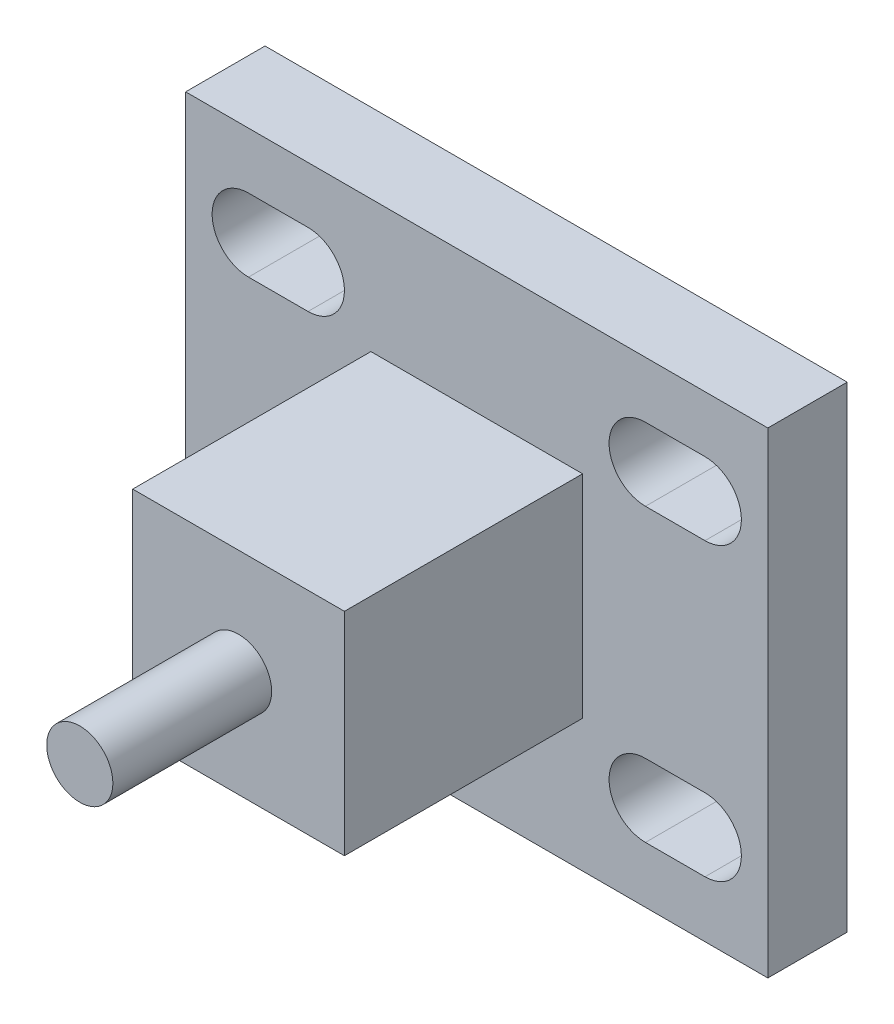
ISO-10303-21;
HEADER;
FILE_DESCRIPTION(('STEP AP214'),'2;1');
FILE_NAME('part.step','',(''),(''),'','','');
FILE_SCHEMA(('AUTOMOTIVE_DESIGN { 1 0 10303 214 1 1 1 1 }'));
ENDSEC;
DATA;
#1=APPLICATION_CONTEXT('core data for automotive mechanical design processes');
#2=APPLICATION_PROTOCOL_DEFINITION('international standard','automotive_design',2000,#1);
#3=PRODUCT_CONTEXT('',#1,'mechanical');
#4=PRODUCT('Part','Part','',(#3));
#5=PRODUCT_RELATED_PRODUCT_CATEGORY('part','',(#4));
#6=PRODUCT_DEFINITION_FORMATION('','',#4);
#7=PRODUCT_DEFINITION_CONTEXT('part definition',#1,'design');
#8=PRODUCT_DEFINITION('design','',#6,#7);
#9=PRODUCT_DEFINITION_SHAPE('','',#8);
#10=(LENGTH_UNIT() NAMED_UNIT(*) SI_UNIT(.MILLI.,.METRE.));
#11=(NAMED_UNIT(*) PLANE_ANGLE_UNIT() SI_UNIT($,.RADIAN.));
#12=(NAMED_UNIT(*) SI_UNIT($,.STERADIAN.) SOLID_ANGLE_UNIT());
#13=UNCERTAINTY_MEASURE_WITH_UNIT(LENGTH_MEASURE(1.E-05),#10,'distance_accuracy_value','');
#14=(GEOMETRIC_REPRESENTATION_CONTEXT(3) GLOBAL_UNCERTAINTY_ASSIGNED_CONTEXT((#13)) GLOBAL_UNIT_ASSIGNED_CONTEXT((#10,
#11,#12)) REPRESENTATION_CONTEXT('',''));
#15=CARTESIAN_POINT('',(0.,0.,0.));
#16=DIRECTION('',(0.,0.,1.));
#17=DIRECTION('',(1.,0.,0.));
#18=AXIS2_PLACEMENT_3D('',#15,#16,#17);
#19=CARTESIAN_POINT('',(0.,0.,36.));
#20=DIRECTION('',(0.,0.,1.));
#21=DIRECTION('',(1.,0.,0.));
#22=AXIS2_PLACEMENT_3D('',#19,#20,#21);
#23=PLANE('',#22);
#24=CARTESIAN_POINT('',(0.,0.,36.));
#25=DIRECTION('',(0.,0.,1.));
#26=DIRECTION('',(1.,0.,0.));
#27=AXIS2_PLACEMENT_3D('',#24,#25,#26);
#28=CIRCLE('',#27,2.5);
#29=CARTESIAN_POINT('',(2.5,0.,36.));
#30=VERTEX_POINT('',#29);
#31=EDGE_CURVE('E10',#30,#30,#28,.T.);
#32=ORIENTED_EDGE('',*,*,#31,.T.);
#33=EDGE_LOOP('',(#32));
#34=FACE_BOUND('',#33,.T.);
#35=ADVANCED_FACE('F16',(#34),#23,.T.);
#36=CARTESIAN_POINT('',(0.,0.,24.));
#37=DIRECTION('',(0.,0.,1.));
#38=DIRECTION('',(1.,0.,0.));
#39=AXIS2_PLACEMENT_3D('',#36,#37,#38);
#40=CYLINDRICAL_SURFACE('',#39,2.5);
#41=ORIENTED_EDGE('',*,*,#31,.F.);
#42=EDGE_LOOP('',(#41));
#43=FACE_BOUND('',#42,.T.);
#44=CARTESIAN_POINT('',(0.,0.,24.));
#45=DIRECTION('',(0.,0.,1.));
#46=DIRECTION('',(1.,0.,0.));
#47=AXIS2_PLACEMENT_3D('',#44,#45,#46);
#48=CIRCLE('',#47,2.5);
#49=CARTESIAN_POINT('',(2.5,0.,24.));
#50=VERTEX_POINT('',#49);
#51=EDGE_CURVE('E26',#50,#50,#48,.T.);
#52=ORIENTED_EDGE('',*,*,#51,.T.);
#53=EDGE_LOOP('',(#52));
#54=FACE_BOUND('',#53,.T.);
#55=ADVANCED_FACE('F559',(#43,#54),#40,.T.);
#56=CARTESIAN_POINT('',(-8.,-8.,24.));
#57=DIRECTION('',(0.,0.,1.));
#58=DIRECTION('',(1.,0.,0.));
#59=AXIS2_PLACEMENT_3D('',#56,#57,#58);
#60=PLANE('',#59);
#61=ORIENTED_EDGE('',*,*,#51,.F.);
#62=EDGE_LOOP('',(#61));
#63=FACE_BOUND('',#62,.T.);
#64=DIRECTION('',(0.,1.,0.));
#65=VECTOR('',#64,1.);
#66=CARTESIAN_POINT('',(-8.,-8.,24.));
#67=LINE('',#66,#65);
#68=CARTESIAN_POINT('',(-8.,-8.,24.));
#69=VERTEX_POINT('',#68);
#70=CARTESIAN_POINT('',(-8.,8.,24.));
#71=VERTEX_POINT('',#70);
#72=EDGE_CURVE('E160',#69,#71,#67,.T.);
#73=ORIENTED_EDGE('',*,*,#72,.F.);
#74=DIRECTION('',(1.,0.,0.));
#75=VECTOR('',#74,1.);
#76=CARTESIAN_POINT('',(-8.,-8.,24.));
#77=LINE('',#76,#75);
#78=CARTESIAN_POINT('',(8.,-8.,24.));
#79=VERTEX_POINT('',#78);
#80=EDGE_CURVE('E192',#69,#79,#77,.T.);
#81=ORIENTED_EDGE('',*,*,#80,.T.);
#82=DIRECTION('',(0.,1.,0.));
#83=VECTOR('',#82,1.);
#84=CARTESIAN_POINT('',(8.,-8.,24.));
#85=LINE('',#84,#83);
#86=CARTESIAN_POINT('',(8.,8.,24.));
#87=VERTEX_POINT('',#86);
#88=EDGE_CURVE('E39',#79,#87,#85,.T.);
#89=ORIENTED_EDGE('',*,*,#88,.T.);
#90=DIRECTION('',(1.,0.,0.));
#91=VECTOR('',#90,1.);
#92=CARTESIAN_POINT('',(-8.,8.,24.));
#93=LINE('',#92,#91);
#94=EDGE_CURVE('E156',#71,#87,#93,.T.);
#95=ORIENTED_EDGE('',*,*,#94,.F.);
#96=EDGE_LOOP('',(#73,#81,#89,#95));
#97=FACE_BOUND('',#96,.T.);
#98=ADVANCED_FACE('F158',(#63,#97),#60,.T.);
#99=CARTESIAN_POINT('',(17.25,8.25,-1.));
#100=DIRECTION('',(0.,1.,0.));
#101=DIRECTION('',(1.,0.,0.));
#102=AXIS2_PLACEMENT_3D('',#99,#100,#101);
#103=PLANE('',#102);
#104=DIRECTION('',(0.,0.,1.));
#105=VECTOR('',#104,1.);
#106=CARTESIAN_POINT('',(17.25,8.25,-1.));
#107=LINE('',#106,#105);
#108=CARTESIAN_POINT('',(17.25,8.25,0.));
#109=VERTEX_POINT('',#108);
#110=CARTESIAN_POINT('',(17.25,8.25,6.));
#111=VERTEX_POINT('',#110);
#112=EDGE_CURVE('E191',#109,#111,#107,.T.);
#113=ORIENTED_EDGE('',*,*,#112,.F.);
#114=DIRECTION('',(-1.,0.,0.));
#115=VECTOR('',#114,1.);
#116=CARTESIAN_POINT('',(-2.375,8.25,0.));
#117=LINE('',#116,#115);
#118=CARTESIAN_POINT('',(12.75,8.25,0.));
#119=VERTEX_POINT('',#118);
#120=EDGE_CURVE('E351',#109,#119,#117,.T.);
#121=ORIENTED_EDGE('',*,*,#120,.T.);
#122=DIRECTION('',(0.,0.,1.));
#123=VECTOR('',#122,1.);
#124=CARTESIAN_POINT('',(12.75,8.25,-1.));
#125=LINE('',#124,#123);
#126=CARTESIAN_POINT('',(12.75,8.25,6.));
#127=VERTEX_POINT('',#126);
#128=EDGE_CURVE('E19',#119,#127,#125,.T.);
#129=ORIENTED_EDGE('',*,*,#128,.T.);
#130=DIRECTION('',(-1.,0.,0.));
#131=VECTOR('',#130,1.);
#132=CARTESIAN_POINT('',(-2.375,8.25,6.));
#133=LINE('',#132,#131);
#134=EDGE_CURVE('E292',#111,#127,#133,.T.);
#135=ORIENTED_EDGE('',*,*,#134,.F.);
#136=EDGE_LOOP('',(#113,#121,#129,#135));
#137=FACE_BOUND('',#136,.T.);
#138=ADVANCED_FACE('F569',(#137),#103,.T.);
#139=CARTESIAN_POINT('',(12.75,11.,-1.));
#140=DIRECTION('',(0.,0.,1.));
#141=DIRECTION('',(0.,1.,0.));
#142=AXIS2_PLACEMENT_3D('',#139,#140,#141);
#143=CYLINDRICAL_SURFACE('',#142,2.75);
#144=ORIENTED_EDGE('',*,*,#128,.F.);
#145=CARTESIAN_POINT('',(12.75,11.,0.));
#146=DIRECTION('',(0.,0.,1.));
#147=DIRECTION('',(0.,1.,0.));
#148=AXIS2_PLACEMENT_3D('',#145,#146,#147);
#149=CIRCLE('',#148,2.75);
#150=CARTESIAN_POINT('',(12.75,13.75,0.));
#151=VERTEX_POINT('',#150);
#152=EDGE_CURVE('E360',#151,#119,#149,.T.);
#153=ORIENTED_EDGE('',*,*,#152,.F.);
#154=DIRECTION('',(0.,0.,1.));
#155=VECTOR('',#154,1.);
#156=CARTESIAN_POINT('',(12.75,13.75,-1.));
#157=LINE('',#156,#155);
#158=CARTESIAN_POINT('',(12.75,13.75,6.));
#159=VERTEX_POINT('',#158);
#160=EDGE_CURVE('E195',#151,#159,#157,.T.);
#161=ORIENTED_EDGE('',*,*,#160,.T.);
#162=CARTESIAN_POINT('',(12.75,11.,6.));
#163=DIRECTION('',(0.,0.,1.));
#164=DIRECTION('',(0.,1.,0.));
#165=AXIS2_PLACEMENT_3D('',#162,#163,#164);
#166=CIRCLE('',#165,2.75);
#167=EDGE_CURVE('E302',#159,#127,#166,.T.);
#168=ORIENTED_EDGE('',*,*,#167,.T.);
#169=EDGE_LOOP('',(#144,#153,#161,#168));
#170=FACE_BOUND('',#169,.T.);
#171=ADVANCED_FACE('F575',(#170),#143,.F.);
#172=CARTESIAN_POINT('',(17.25,13.75,-1.));
#173=DIRECTION('',(0.,1.,0.));
#174=DIRECTION('',(1.,0.,0.));
#175=AXIS2_PLACEMENT_3D('',#172,#173,#174);
#176=PLANE('',#175);
#177=DIRECTION('',(-1.,0.,0.));
#178=VECTOR('',#177,1.);
#179=CARTESIAN_POINT('',(-2.375,13.75,6.));
#180=LINE('',#179,#178);
#181=CARTESIAN_POINT('',(17.25,13.75,6.));
#182=VERTEX_POINT('',#181);
#183=EDGE_CURVE('E305',#182,#159,#180,.T.);
#184=ORIENTED_EDGE('',*,*,#183,.T.);
#185=ORIENTED_EDGE('',*,*,#160,.F.);
#186=DIRECTION('',(-1.,0.,0.));
#187=VECTOR('',#186,1.);
#188=CARTESIAN_POINT('',(-2.375,13.75,0.));
#189=LINE('',#188,#187);
#190=CARTESIAN_POINT('',(17.25,13.75,0.));
#191=VERTEX_POINT('',#190);
#192=EDGE_CURVE('E356',#191,#151,#189,.T.);
#193=ORIENTED_EDGE('',*,*,#192,.F.);
#194=DIRECTION('',(0.,0.,1.));
#195=VECTOR('',#194,1.);
#196=CARTESIAN_POINT('',(17.25,13.75,-1.));
#197=LINE('',#196,#195);
#198=EDGE_CURVE('E193',#191,#182,#197,.T.);
#199=ORIENTED_EDGE('',*,*,#198,.T.);
#200=EDGE_LOOP('',(#184,#185,#193,#199));
#201=FACE_BOUND('',#200,.T.);
#202=ADVANCED_FACE('F578',(#201),#176,.F.);
#203=CARTESIAN_POINT('',(17.25,11.,-1.));
#204=DIRECTION('',(0.,0.,1.));
#205=DIRECTION('',(0.,1.,0.));
#206=AXIS2_PLACEMENT_3D('',#203,#204,#205);
#207=CYLINDRICAL_SURFACE('',#206,2.75);
#208=ORIENTED_EDGE('',*,*,#112,.T.);
#209=CARTESIAN_POINT('',(17.25,11.,6.));
#210=DIRECTION('',(0.,0.,1.));
#211=DIRECTION('',(0.,1.,0.));
#212=AXIS2_PLACEMENT_3D('',#209,#210,#211);
#213=CIRCLE('',#212,2.75);
#214=EDGE_CURVE('E288',#111,#182,#213,.T.);
#215=ORIENTED_EDGE('',*,*,#214,.T.);
#216=ORIENTED_EDGE('',*,*,#198,.F.);
#217=CARTESIAN_POINT('',(17.25,11.,0.));
#218=DIRECTION('',(0.,0.,1.));
#219=DIRECTION('',(0.,1.,0.));
#220=AXIS2_PLACEMENT_3D('',#217,#218,#219);
#221=CIRCLE('',#220,2.75);
#222=EDGE_CURVE('E346',#109,#191,#221,.T.);
#223=ORIENTED_EDGE('',*,*,#222,.F.);
#224=EDGE_LOOP('',(#208,#215,#216,#223));
#225=FACE_BOUND('',#224,.T.);
#226=ADVANCED_FACE('F581',(#225),#207,.F.);
#227=CARTESIAN_POINT('',(8.,-8.,6.));
#228=DIRECTION('',(1.,0.,0.));
#229=DIRECTION('',(0.,1.,0.));
#230=AXIS2_PLACEMENT_3D('',#227,#228,#229);
#231=PLANE('',#230);
#232=DIRECTION('',(0.,0.,1.));
#233=VECTOR('',#232,1.);
#234=CARTESIAN_POINT('',(8.,-8.,6.));
#235=LINE('',#234,#233);
#236=CARTESIAN_POINT('',(8.,-8.,6.));
#237=VERTEX_POINT('',#236);
#238=EDGE_CURVE('E188',#237,#79,#235,.T.);
#239=ORIENTED_EDGE('',*,*,#238,.F.);
#240=DIRECTION('',(0.,1.,0.));
#241=VECTOR('',#240,1.);
#242=CARTESIAN_POINT('',(8.,-8.,6.));
#243=LINE('',#242,#241);
#244=CARTESIAN_POINT('',(8.,8.,6.));
#245=VERTEX_POINT('',#244);
#246=EDGE_CURVE('E272',#237,#245,#243,.T.);
#247=ORIENTED_EDGE('',*,*,#246,.T.);
#248=DIRECTION('',(0.,0.,1.));
#249=VECTOR('',#248,1.);
#250=CARTESIAN_POINT('',(8.,8.,6.));
#251=LINE('',#250,#249);
#252=EDGE_CURVE('E163',#245,#87,#251,.T.);
#253=ORIENTED_EDGE('',*,*,#252,.T.);
#254=ORIENTED_EDGE('',*,*,#88,.F.);
#255=EDGE_LOOP('',(#239,#247,#253,#254));
#256=FACE_BOUND('',#255,.T.);
#257=ADVANCED_FACE('F585',(#256),#231,.T.);
#258=CARTESIAN_POINT('',(-8.,-8.,6.));
#259=DIRECTION('',(0.,1.,0.));
#260=DIRECTION('',(1.,0.,0.));
#261=AXIS2_PLACEMENT_3D('',#258,#259,#260);
#262=PLANE('',#261);
#263=ORIENTED_EDGE('',*,*,#238,.T.);
#264=ORIENTED_EDGE('',*,*,#80,.F.);
#265=DIRECTION('',(0.,0.,1.));
#266=VECTOR('',#265,1.);
#267=CARTESIAN_POINT('',(-8.,-8.,6.));
#268=LINE('',#267,#266);
#269=CARTESIAN_POINT('',(-8.,-8.,6.));
#270=VERTEX_POINT('',#269);
#271=EDGE_CURVE('E164',#270,#69,#268,.T.);
#272=ORIENTED_EDGE('',*,*,#271,.F.);
#273=DIRECTION('',(1.,0.,0.));
#274=VECTOR('',#273,1.);
#275=CARTESIAN_POINT('',(-8.,-8.,6.));
#276=LINE('',#275,#274);
#277=EDGE_CURVE('E276',#270,#237,#276,.T.);
#278=ORIENTED_EDGE('',*,*,#277,.T.);
#279=EDGE_LOOP('',(#263,#264,#272,#278));
#280=FACE_BOUND('',#279,.T.);
#281=ADVANCED_FACE('F587',(#280),#262,.F.);
#282=CARTESIAN_POINT('',(-8.,8.,6.));
#283=DIRECTION('',(0.,1.,0.));
#284=DIRECTION('',(1.,0.,0.));
#285=AXIS2_PLACEMENT_3D('',#282,#283,#284);
#286=PLANE('',#285);
#287=DIRECTION('',(1.,0.,0.));
#288=VECTOR('',#287,1.);
#289=CARTESIAN_POINT('',(-8.,8.,6.));
#290=LINE('',#289,#288);
#291=CARTESIAN_POINT('',(-8.,8.,6.));
#292=VERTEX_POINT('',#291);
#293=EDGE_CURVE('E170',#292,#245,#290,.T.);
#294=ORIENTED_EDGE('',*,*,#293,.F.);
#295=DIRECTION('',(0.,0.,1.));
#296=VECTOR('',#295,1.);
#297=CARTESIAN_POINT('',(-8.,8.,6.));
#298=LINE('',#297,#296);
#299=EDGE_CURVE('E167',#292,#71,#298,.T.);
#300=ORIENTED_EDGE('',*,*,#299,.T.);
#301=ORIENTED_EDGE('',*,*,#94,.T.);
#302=ORIENTED_EDGE('',*,*,#252,.F.);
#303=EDGE_LOOP('',(#294,#300,#301,#302));
#304=FACE_BOUND('',#303,.T.);
#305=ADVANCED_FACE('F168',(#304),#286,.T.);
#306=CARTESIAN_POINT('',(-8.,-8.,6.));
#307=DIRECTION('',(1.,0.,0.));
#308=DIRECTION('',(0.,1.,0.));
#309=AXIS2_PLACEMENT_3D('',#306,#307,#308);
#310=PLANE('',#309);
#311=ORIENTED_EDGE('',*,*,#72,.T.);
#312=ORIENTED_EDGE('',*,*,#299,.F.);
#313=DIRECTION('',(0.,1.,0.));
#314=VECTOR('',#313,1.);
#315=CARTESIAN_POINT('',(-8.,-8.,6.));
#316=LINE('',#315,#314);
#317=EDGE_CURVE('E267',#270,#292,#316,.T.);
#318=ORIENTED_EDGE('',*,*,#317,.F.);
#319=ORIENTED_EDGE('',*,*,#271,.T.);
#320=EDGE_LOOP('',(#311,#312,#318,#319));
#321=FACE_BOUND('',#320,.T.);
#322=ADVANCED_FACE('F177',(#321),#310,.F.);
#323=CARTESIAN_POINT('',(-17.25,11.,-1.));
#324=DIRECTION('',(0.,0.,1.));
#325=DIRECTION('',(0.,1.,0.));
#326=AXIS2_PLACEMENT_3D('',#323,#324,#325);
#327=CYLINDRICAL_SURFACE('',#326,2.75);
#328=DIRECTION('',(0.,0.,1.));
#329=VECTOR('',#328,1.);
#330=CARTESIAN_POINT('',(-17.25,8.25,-1.));
#331=LINE('',#330,#329);
#332=CARTESIAN_POINT('',(-17.25,8.25,0.));
#333=VERTEX_POINT('',#332);
#334=CARTESIAN_POINT('',(-17.25,8.25,6.));
#335=VERTEX_POINT('',#334);
#336=EDGE_CURVE('E184',#333,#335,#331,.T.);
#337=ORIENTED_EDGE('',*,*,#336,.F.);
#338=CARTESIAN_POINT('',(-17.25,11.,0.));
#339=DIRECTION('',(0.,0.,1.));
#340=DIRECTION('',(0.,1.,0.));
#341=AXIS2_PLACEMENT_3D('',#338,#339,#340);
#342=CIRCLE('',#341,2.75);
#343=CARTESIAN_POINT('',(-17.25,13.75,0.));
#344=VERTEX_POINT('',#343);
#345=EDGE_CURVE('E318',#344,#333,#342,.T.);
#346=ORIENTED_EDGE('',*,*,#345,.F.);
#347=DIRECTION('',(0.,0.,1.));
#348=VECTOR('',#347,1.);
#349=CARTESIAN_POINT('',(-17.25,13.75,-1.));
#350=LINE('',#349,#348);
#351=CARTESIAN_POINT('',(-17.25,13.75,6.));
#352=VERTEX_POINT('',#351);
#353=EDGE_CURVE('E179',#344,#352,#350,.T.);
#354=ORIENTED_EDGE('',*,*,#353,.T.);
#355=CARTESIAN_POINT('',(-17.25,11.,6.));
#356=DIRECTION('',(0.,0.,1.));
#357=DIRECTION('',(0.,1.,0.));
#358=AXIS2_PLACEMENT_3D('',#355,#356,#357);
#359=CIRCLE('',#358,2.75);
#360=EDGE_CURVE('E259',#352,#335,#359,.T.);
#361=ORIENTED_EDGE('',*,*,#360,.T.);
#362=EDGE_LOOP('',(#337,#346,#354,#361));
#363=FACE_BOUND('',#362,.T.);
#364=ADVANCED_FACE('F467',(#363),#327,.F.);
#365=CARTESIAN_POINT('',(-12.75,13.75,-1.));
#366=DIRECTION('',(0.,1.,0.));
#367=DIRECTION('',(1.,0.,0.));
#368=AXIS2_PLACEMENT_3D('',#365,#366,#367);
#369=PLANE('',#368);
#370=DIRECTION('',(-1.,0.,0.));
#371=VECTOR('',#370,1.);
#372=CARTESIAN_POINT('',(-17.375,13.75,6.));
#373=LINE('',#372,#371);
#374=CARTESIAN_POINT('',(-12.75,13.75,6.));
#375=VERTEX_POINT('',#374);
#376=EDGE_CURVE('E263',#375,#352,#373,.T.);
#377=ORIENTED_EDGE('',*,*,#376,.T.);
#378=ORIENTED_EDGE('',*,*,#353,.F.);
#379=DIRECTION('',(-1.,0.,0.));
#380=VECTOR('',#379,1.);
#381=CARTESIAN_POINT('',(-17.375,13.75,0.));
#382=LINE('',#381,#380);
#383=CARTESIAN_POINT('',(-12.75,13.75,0.));
#384=VERTEX_POINT('',#383);
#385=EDGE_CURVE('E297',#384,#344,#382,.T.);
#386=ORIENTED_EDGE('',*,*,#385,.F.);
#387=DIRECTION('',(0.,0.,1.));
#388=VECTOR('',#387,1.);
#389=CARTESIAN_POINT('',(-12.75,13.75,-1.));
#390=LINE('',#389,#388);
#391=EDGE_CURVE('E237',#384,#375,#390,.T.);
#392=ORIENTED_EDGE('',*,*,#391,.T.);
#393=EDGE_LOOP('',(#377,#378,#386,#392));
#394=FACE_BOUND('',#393,.T.);
#395=ADVANCED_FACE('F463',(#394),#369,.F.);
#396=CARTESIAN_POINT('',(-12.75,8.25,-1.));
#397=DIRECTION('',(0.,1.,0.));
#398=DIRECTION('',(1.,0.,0.));
#399=AXIS2_PLACEMENT_3D('',#396,#397,#398);
#400=PLANE('',#399);
#401=DIRECTION('',(0.,0.,1.));
#402=VECTOR('',#401,1.);
#403=CARTESIAN_POINT('',(-12.75,8.25,-1.));
#404=LINE('',#403,#402);
#405=CARTESIAN_POINT('',(-12.75,8.25,0.));
#406=VERTEX_POINT('',#405);
#407=CARTESIAN_POINT('',(-12.75,8.25,6.));
#408=VERTEX_POINT('',#407);
#409=EDGE_CURVE('E233',#406,#408,#404,.T.);
#410=ORIENTED_EDGE('',*,*,#409,.F.);
#411=DIRECTION('',(-1.,0.,0.));
#412=VECTOR('',#411,1.);
#413=CARTESIAN_POINT('',(-17.375,8.25,0.));
#414=LINE('',#413,#412);
#415=EDGE_CURVE('E345',#406,#333,#414,.T.);
#416=ORIENTED_EDGE('',*,*,#415,.T.);
#417=ORIENTED_EDGE('',*,*,#336,.T.);
#418=DIRECTION('',(-1.,0.,0.));
#419=VECTOR('',#418,1.);
#420=CARTESIAN_POINT('',(-17.375,8.25,6.));
#421=LINE('',#420,#419);
#422=EDGE_CURVE('E255',#408,#335,#421,.T.);
#423=ORIENTED_EDGE('',*,*,#422,.F.);
#424=EDGE_LOOP('',(#410,#416,#417,#423));
#425=FACE_BOUND('',#424,.T.);
#426=ADVANCED_FACE('F468',(#425),#400,.T.);
#427=CARTESIAN_POINT('',(-12.75,11.,-1.));
#428=DIRECTION('',(0.,0.,1.));
#429=DIRECTION('',(0.,1.,0.));
#430=AXIS2_PLACEMENT_3D('',#427,#428,#429);
#431=CYLINDRICAL_SURFACE('',#430,2.75);
#432=ORIENTED_EDGE('',*,*,#409,.T.);
#433=CARTESIAN_POINT('',(-12.75,11.,6.));
#434=DIRECTION('',(0.,0.,1.));
#435=DIRECTION('',(0.,1.,0.));
#436=AXIS2_PLACEMENT_3D('',#433,#434,#435);
#437=CIRCLE('',#436,2.75);
#438=EDGE_CURVE('E251',#408,#375,#437,.T.);
#439=ORIENTED_EDGE('',*,*,#438,.T.);
#440=ORIENTED_EDGE('',*,*,#391,.F.);
#441=CARTESIAN_POINT('',(-12.75,11.,0.));
#442=DIRECTION('',(0.,0.,1.));
#443=DIRECTION('',(0.,1.,0.));
#444=AXIS2_PLACEMENT_3D('',#441,#442,#443);
#445=CIRCLE('',#444,2.75);
#446=EDGE_CURVE('E355',#406,#384,#445,.T.);
#447=ORIENTED_EDGE('',*,*,#446,.F.);
#448=EDGE_LOOP('',(#432,#439,#440,#447));
#449=FACE_BOUND('',#448,.T.);
#450=ADVANCED_FACE('F471',(#449),#431,.F.);
#451=CARTESIAN_POINT('',(12.75,-11.,-1.));
#452=DIRECTION('',(0.,0.,1.));
#453=DIRECTION('',(0.,1.,0.));
#454=AXIS2_PLACEMENT_3D('',#451,#452,#453);
#455=CYLINDRICAL_SURFACE('',#454,2.75);
#456=DIRECTION('',(0.,0.,1.));
#457=VECTOR('',#456,1.);
#458=CARTESIAN_POINT('',(12.75,-13.75,-1.));
#459=LINE('',#458,#457);
#460=CARTESIAN_POINT('',(12.75,-13.75,0.));
#461=VERTEX_POINT('',#460);
#462=CARTESIAN_POINT('',(12.75,-13.75,6.));
#463=VERTEX_POINT('',#462);
#464=EDGE_CURVE('E388',#461,#463,#459,.T.);
#465=ORIENTED_EDGE('',*,*,#464,.F.);
#466=CARTESIAN_POINT('',(12.75,-11.,0.));
#467=DIRECTION('',(0.,0.,1.));
#468=DIRECTION('',(0.,1.,0.));
#469=AXIS2_PLACEMENT_3D('',#466,#467,#468);
#470=CIRCLE('',#469,2.75);
#471=CARTESIAN_POINT('',(12.75,-8.25,0.));
#472=VERTEX_POINT('',#471);
#473=EDGE_CURVE('E338',#472,#461,#470,.T.);
#474=ORIENTED_EDGE('',*,*,#473,.F.);
#475=DIRECTION('',(0.,0.,1.));
#476=VECTOR('',#475,1.);
#477=CARTESIAN_POINT('',(12.75,-8.25,-1.));
#478=LINE('',#477,#476);
#479=CARTESIAN_POINT('',(12.75,-8.25,6.));
#480=VERTEX_POINT('',#479);
#481=EDGE_CURVE('E238',#472,#480,#478,.T.);
#482=ORIENTED_EDGE('',*,*,#481,.T.);
#483=CARTESIAN_POINT('',(12.75,-11.,6.));
#484=DIRECTION('',(0.,0.,1.));
#485=DIRECTION('',(0.,1.,0.));
#486=AXIS2_PLACEMENT_3D('',#483,#484,#485);
#487=CIRCLE('',#486,2.75);
#488=EDGE_CURVE('E243',#480,#463,#487,.T.);
#489=ORIENTED_EDGE('',*,*,#488,.T.);
#490=EDGE_LOOP('',(#465,#474,#482,#489));
#491=FACE_BOUND('',#490,.T.);
#492=ADVANCED_FACE('F531',(#491),#455,.F.);
#493=CARTESIAN_POINT('',(17.25,-8.25,-1.));
#494=DIRECTION('',(0.,1.,0.));
#495=DIRECTION('',(1.,0.,0.));
#496=AXIS2_PLACEMENT_3D('',#493,#494,#495);
#497=PLANE('',#496);
#498=DIRECTION('',(-1.,0.,0.));
#499=VECTOR('',#498,1.);
#500=CARTESIAN_POINT('',(-2.375,-8.25,6.));
#501=LINE('',#500,#499);
#502=CARTESIAN_POINT('',(17.25,-8.25,6.));
#503=VERTEX_POINT('',#502);
#504=EDGE_CURVE('E247',#503,#480,#501,.T.);
#505=ORIENTED_EDGE('',*,*,#504,.T.);
#506=ORIENTED_EDGE('',*,*,#481,.F.);
#507=DIRECTION('',(-1.,0.,0.));
#508=VECTOR('',#507,1.);
#509=CARTESIAN_POINT('',(-2.375,-8.25,0.));
#510=LINE('',#509,#508);
#511=CARTESIAN_POINT('',(17.25,-8.25,0.));
#512=VERTEX_POINT('',#511);
#513=EDGE_CURVE('E334',#512,#472,#510,.T.);
#514=ORIENTED_EDGE('',*,*,#513,.F.);
#515=DIRECTION('',(0.,0.,1.));
#516=VECTOR('',#515,1.);
#517=CARTESIAN_POINT('',(17.25,-8.25,-1.));
#518=LINE('',#517,#516);
#519=EDGE_CURVE('E384',#512,#503,#518,.T.);
#520=ORIENTED_EDGE('',*,*,#519,.T.);
#521=EDGE_LOOP('',(#505,#506,#514,#520));
#522=FACE_BOUND('',#521,.T.);
#523=ADVANCED_FACE('F546',(#522),#497,.F.);
#524=CARTESIAN_POINT('',(17.25,-13.75,-1.));
#525=DIRECTION('',(0.,1.,0.));
#526=DIRECTION('',(1.,0.,0.));
#527=AXIS2_PLACEMENT_3D('',#524,#525,#526);
#528=PLANE('',#527);
#529=DIRECTION('',(0.,0.,1.));
#530=VECTOR('',#529,1.);
#531=CARTESIAN_POINT('',(17.25,-13.75,-1.));
#532=LINE('',#531,#530);
#533=CARTESIAN_POINT('',(17.25,-13.75,0.));
#534=VERTEX_POINT('',#533);
#535=CARTESIAN_POINT('',(17.25,-13.75,6.));
#536=VERTEX_POINT('',#535);
#537=EDGE_CURVE('E380',#534,#536,#532,.T.);
#538=ORIENTED_EDGE('',*,*,#537,.F.);
#539=DIRECTION('',(-1.,0.,0.));
#540=VECTOR('',#539,1.);
#541=CARTESIAN_POINT('',(-2.375,-13.75,0.));
#542=LINE('',#541,#540);
#543=EDGE_CURVE('E298',#534,#461,#542,.T.);
#544=ORIENTED_EDGE('',*,*,#543,.T.);
#545=ORIENTED_EDGE('',*,*,#464,.T.);
#546=DIRECTION('',(-1.,0.,0.));
#547=VECTOR('',#546,1.);
#548=CARTESIAN_POINT('',(-2.375,-13.75,6.));
#549=LINE('',#548,#547);
#550=EDGE_CURVE('E239',#536,#463,#549,.T.);
#551=ORIENTED_EDGE('',*,*,#550,.F.);
#552=EDGE_LOOP('',(#538,#544,#545,#551));
#553=FACE_BOUND('',#552,.T.);
#554=ADVANCED_FACE('F525',(#553),#528,.T.);
#555=CARTESIAN_POINT('',(17.25,-11.,-1.));
#556=DIRECTION('',(0.,0.,1.));
#557=DIRECTION('',(0.,1.,0.));
#558=AXIS2_PLACEMENT_3D('',#555,#556,#557);
#559=CYLINDRICAL_SURFACE('',#558,2.75);
#560=ORIENTED_EDGE('',*,*,#537,.T.);
#561=CARTESIAN_POINT('',(17.25,-11.,6.));
#562=DIRECTION('',(0.,0.,1.));
#563=DIRECTION('',(0.,1.,0.));
#564=AXIS2_PLACEMENT_3D('',#561,#562,#563);
#565=CIRCLE('',#564,2.75);
#566=EDGE_CURVE('E218',#536,#503,#565,.T.);
#567=ORIENTED_EDGE('',*,*,#566,.T.);
#568=ORIENTED_EDGE('',*,*,#519,.F.);
#569=CARTESIAN_POINT('',(17.25,-11.,0.));
#570=DIRECTION('',(0.,0.,1.));
#571=DIRECTION('',(0.,1.,0.));
#572=AXIS2_PLACEMENT_3D('',#569,#570,#571);
#573=CIRCLE('',#572,2.75);
#574=EDGE_CURVE('E293',#534,#512,#573,.T.);
#575=ORIENTED_EDGE('',*,*,#574,.F.);
#576=EDGE_LOOP('',(#560,#567,#568,#575));
#577=FACE_BOUND('',#576,.T.);
#578=ADVANCED_FACE('F541',(#577),#559,.F.);
#579=CARTESIAN_POINT('',(-17.25,-11.,-1.));
#580=DIRECTION('',(0.,0.,1.));
#581=DIRECTION('',(0.,1.,0.));
#582=AXIS2_PLACEMENT_3D('',#579,#580,#581);
#583=CYLINDRICAL_SURFACE('',#582,2.75);
#584=DIRECTION('',(0.,0.,1.));
#585=VECTOR('',#584,1.);
#586=CARTESIAN_POINT('',(-17.25,-13.75,-1.));
#587=LINE('',#586,#585);
#588=CARTESIAN_POINT('',(-17.25,-13.75,0.));
#589=VERTEX_POINT('',#588);
#590=CARTESIAN_POINT('',(-17.25,-13.75,6.));
#591=VERTEX_POINT('',#590);
#592=EDGE_CURVE('E370',#589,#591,#587,.T.);
#593=ORIENTED_EDGE('',*,*,#592,.F.);
#594=CARTESIAN_POINT('',(-17.25,-11.,0.));
#595=DIRECTION('',(0.,0.,1.));
#596=DIRECTION('',(0.,1.,0.));
#597=AXIS2_PLACEMENT_3D('',#594,#595,#596);
#598=CIRCLE('',#597,2.75);
#599=CARTESIAN_POINT('',(-17.25,-8.25,0.));
#600=VERTEX_POINT('',#599);
#601=EDGE_CURVE('E284',#600,#589,#598,.T.);
#602=ORIENTED_EDGE('',*,*,#601,.F.);
#603=DIRECTION('',(0.,0.,1.));
#604=VECTOR('',#603,1.);
#605=CARTESIAN_POINT('',(-17.25,-8.25,-1.));
#606=LINE('',#605,#604);
#607=CARTESIAN_POINT('',(-17.25,-8.25,6.));
#608=VERTEX_POINT('',#607);
#609=EDGE_CURVE('E374',#600,#608,#606,.T.);
#610=ORIENTED_EDGE('',*,*,#609,.T.);
#611=CARTESIAN_POINT('',(-17.25,-11.,6.));
#612=DIRECTION('',(0.,0.,1.));
#613=DIRECTION('',(0.,1.,0.));
#614=AXIS2_PLACEMENT_3D('',#611,#612,#613);
#615=CIRCLE('',#614,2.75);
#616=EDGE_CURVE('E225',#608,#591,#615,.T.);
#617=ORIENTED_EDGE('',*,*,#616,.T.);
#618=EDGE_LOOP('',(#593,#602,#610,#617));
#619=FACE_BOUND('',#618,.T.);
#620=ADVANCED_FACE('F603',(#619),#583,.F.);
#621=CARTESIAN_POINT('',(-12.75,-8.25,-1.));
#622=DIRECTION('',(0.,1.,0.));
#623=DIRECTION('',(1.,0.,0.));
#624=AXIS2_PLACEMENT_3D('',#621,#622,#623);
#625=PLANE('',#624);
#626=DIRECTION('',(-1.,0.,0.));
#627=VECTOR('',#626,1.);
#628=CARTESIAN_POINT('',(-17.375,-8.25,6.));
#629=LINE('',#628,#627);
#630=CARTESIAN_POINT('',(-12.75,-8.25,6.));
#631=VERTEX_POINT('',#630);
#632=EDGE_CURVE('E229',#631,#608,#629,.T.);
#633=ORIENTED_EDGE('',*,*,#632,.T.);
#634=ORIENTED_EDGE('',*,*,#609,.F.);
#635=DIRECTION('',(-1.,0.,0.));
#636=VECTOR('',#635,1.);
#637=CARTESIAN_POINT('',(-17.375,-8.25,0.));
#638=LINE('',#637,#636);
#639=CARTESIAN_POINT('',(-12.75,-8.25,0.));
#640=VERTEX_POINT('',#639);
#641=EDGE_CURVE('E321',#640,#600,#638,.T.);
#642=ORIENTED_EDGE('',*,*,#641,.F.);
#643=DIRECTION('',(0.,0.,1.));
#644=VECTOR('',#643,1.);
#645=CARTESIAN_POINT('',(-12.75,-8.25,-1.));
#646=LINE('',#645,#644);
#647=EDGE_CURVE('E366',#640,#631,#646,.T.);
#648=ORIENTED_EDGE('',*,*,#647,.T.);
#649=EDGE_LOOP('',(#633,#634,#642,#648));
#650=FACE_BOUND('',#649,.T.);
#651=ADVANCED_FACE('F606',(#650),#625,.F.);
#652=CARTESIAN_POINT('',(-12.75,-13.75,-1.));
#653=DIRECTION('',(0.,1.,0.));
#654=DIRECTION('',(1.,0.,0.));
#655=AXIS2_PLACEMENT_3D('',#652,#653,#654);
#656=PLANE('',#655);
#657=DIRECTION('',(0.,0.,1.));
#658=VECTOR('',#657,1.);
#659=CARTESIAN_POINT('',(-12.75,-13.75,-1.));
#660=LINE('',#659,#658);
#661=CARTESIAN_POINT('',(-12.75,-13.75,0.));
#662=VERTEX_POINT('',#661);
#663=CARTESIAN_POINT('',(-12.75,-13.75,6.));
#664=VERTEX_POINT('',#663);
#665=EDGE_CURVE('E350',#662,#664,#660,.T.);
#666=ORIENTED_EDGE('',*,*,#665,.F.);
#667=DIRECTION('',(-1.,0.,0.));
#668=VECTOR('',#667,1.);
#669=CARTESIAN_POINT('',(-17.375,-13.75,0.));
#670=LINE('',#669,#668);
#671=EDGE_CURVE('E279',#662,#589,#670,.T.);
#672=ORIENTED_EDGE('',*,*,#671,.T.);
#673=ORIENTED_EDGE('',*,*,#592,.T.);
#674=DIRECTION('',(-1.,0.,0.));
#675=VECTOR('',#674,1.);
#676=CARTESIAN_POINT('',(-17.375,-13.75,6.));
#677=LINE('',#676,#675);
#678=EDGE_CURVE('E222',#664,#591,#677,.T.);
#679=ORIENTED_EDGE('',*,*,#678,.F.);
#680=EDGE_LOOP('',(#666,#672,#673,#679));
#681=FACE_BOUND('',#680,.T.);
#682=ADVANCED_FACE('F609',(#681),#656,.T.);
#683=CARTESIAN_POINT('',(-12.75,-11.,-1.));
#684=DIRECTION('',(0.,0.,1.));
#685=DIRECTION('',(0.,1.,0.));
#686=AXIS2_PLACEMENT_3D('',#683,#684,#685);
#687=CYLINDRICAL_SURFACE('',#686,2.75);
#688=ORIENTED_EDGE('',*,*,#665,.T.);
#689=CARTESIAN_POINT('',(-12.75,-11.,6.));
#690=DIRECTION('',(0.,0.,1.));
#691=DIRECTION('',(0.,1.,0.));
#692=AXIS2_PLACEMENT_3D('',#689,#690,#691);
#693=CIRCLE('',#692,2.75);
#694=EDGE_CURVE('E220',#664,#631,#693,.T.);
#695=ORIENTED_EDGE('',*,*,#694,.T.);
#696=ORIENTED_EDGE('',*,*,#647,.F.);
#697=CARTESIAN_POINT('',(-12.75,-11.,0.));
#698=DIRECTION('',(0.,0.,1.));
#699=DIRECTION('',(0.,1.,0.));
#700=AXIS2_PLACEMENT_3D('',#697,#698,#699);
#701=CIRCLE('',#700,2.75);
#702=EDGE_CURVE('E283',#662,#640,#701,.T.);
#703=ORIENTED_EDGE('',*,*,#702,.F.);
#704=EDGE_LOOP('',(#688,#695,#696,#703));
#705=FACE_BOUND('',#704,.T.);
#706=ADVANCED_FACE('F612',(#705),#687,.F.);
#707=CARTESIAN_POINT('',(22.,-18.,0.));
#708=DIRECTION('',(1.,0.,0.));
#709=DIRECTION('',(0.,1.,0.));
#710=AXIS2_PLACEMENT_3D('',#707,#708,#709);
#711=PLANE('',#710);
#712=DIRECTION('',(0.,0.,1.));
#713=VECTOR('',#712,1.);
#714=CARTESIAN_POINT('',(22.,-18.,0.));
#715=LINE('',#714,#713);
#716=CARTESIAN_POINT('',(22.,-18.,0.));
#717=VERTEX_POINT('',#716);
#718=CARTESIAN_POINT('',(22.,-18.,6.));
#719=VERTEX_POINT('',#718);
#720=EDGE_CURVE('E420',#717,#719,#715,.T.);
#721=ORIENTED_EDGE('',*,*,#720,.F.);
#722=DIRECTION('',(0.,1.,0.));
#723=VECTOR('',#722,1.);
#724=CARTESIAN_POINT('',(22.,-18.,0.));
#725=LINE('',#724,#723);
#726=CARTESIAN_POINT('',(22.,18.,0.));
#727=VERTEX_POINT('',#726);
#728=EDGE_CURVE('E314',#717,#727,#725,.T.);
#729=ORIENTED_EDGE('',*,*,#728,.T.);
#730=DIRECTION('',(0.,0.,1.));
#731=VECTOR('',#730,1.);
#732=CARTESIAN_POINT('',(22.,18.,0.));
#733=LINE('',#732,#731);
#734=CARTESIAN_POINT('',(22.,18.,6.));
#735=VERTEX_POINT('',#734);
#736=EDGE_CURVE('E310',#727,#735,#733,.T.);
#737=ORIENTED_EDGE('',*,*,#736,.T.);
#738=DIRECTION('',(0.,1.,0.));
#739=VECTOR('',#738,1.);
#740=CARTESIAN_POINT('',(22.,-18.,6.));
#741=LINE('',#740,#739);
#742=EDGE_CURVE('E409',#719,#735,#741,.T.);
#743=ORIENTED_EDGE('',*,*,#742,.F.);
#744=EDGE_LOOP('',(#721,#729,#737,#743));
#745=FACE_BOUND('',#744,.T.);
#746=ADVANCED_FACE('F615',(#745),#711,.T.);
#747=CARTESIAN_POINT('',(-22.,-18.,0.));
#748=DIRECTION('',(0.,0.,1.));
#749=DIRECTION('',(1.,0.,0.));
#750=AXIS2_PLACEMENT_3D('',#747,#748,#749);
#751=PLANE('',#750);
#752=ORIENTED_EDGE('',*,*,#192,.T.);
#753=ORIENTED_EDGE('',*,*,#152,.T.);
#754=ORIENTED_EDGE('',*,*,#120,.F.);
#755=ORIENTED_EDGE('',*,*,#222,.T.);
#756=EDGE_LOOP('',(#752,#753,#754,#755));
#757=FACE_BOUND('',#756,.T.);
#758=ORIENTED_EDGE('',*,*,#385,.T.);
#759=ORIENTED_EDGE('',*,*,#345,.T.);
#760=ORIENTED_EDGE('',*,*,#415,.F.);
#761=ORIENTED_EDGE('',*,*,#446,.T.);
#762=EDGE_LOOP('',(#758,#759,#760,#761));
#763=FACE_BOUND('',#762,.T.);
#764=ORIENTED_EDGE('',*,*,#513,.T.);
#765=ORIENTED_EDGE('',*,*,#473,.T.);
#766=ORIENTED_EDGE('',*,*,#543,.F.);
#767=ORIENTED_EDGE('',*,*,#574,.T.);
#768=EDGE_LOOP('',(#764,#765,#766,#767));
#769=FACE_BOUND('',#768,.T.);
#770=ORIENTED_EDGE('',*,*,#641,.T.);
#771=ORIENTED_EDGE('',*,*,#601,.T.);
#772=ORIENTED_EDGE('',*,*,#671,.F.);
#773=ORIENTED_EDGE('',*,*,#702,.T.);
#774=EDGE_LOOP('',(#770,#771,#772,#773));
#775=FACE_BOUND('',#774,.T.);
#776=DIRECTION('',(1.,0.,0.));
#777=VECTOR('',#776,1.);
#778=CARTESIAN_POINT('',(-22.,18.,0.));
#779=LINE('',#778,#777);
#780=CARTESIAN_POINT('',(-22.,18.,0.));
#781=VERTEX_POINT('',#780);
#782=EDGE_CURVE('E306',#781,#727,#779,.T.);
#783=ORIENTED_EDGE('',*,*,#782,.T.);
#784=ORIENTED_EDGE('',*,*,#728,.F.);
#785=DIRECTION('',(1.,0.,0.));
#786=VECTOR('',#785,1.);
#787=CARTESIAN_POINT('',(-22.,-18.,0.));
#788=LINE('',#787,#786);
#789=CARTESIAN_POINT('',(-22.,-18.,0.));
#790=VERTEX_POINT('',#789);
#791=EDGE_CURVE('E412',#790,#717,#788,.T.);
#792=ORIENTED_EDGE('',*,*,#791,.F.);
#793=DIRECTION('',(0.,1.,0.));
#794=VECTOR('',#793,1.);
#795=CARTESIAN_POINT('',(-22.,-18.,0.));
#796=LINE('',#795,#794);
#797=EDGE_CURVE('E434',#790,#781,#796,.T.);
#798=ORIENTED_EDGE('',*,*,#797,.T.);
#799=EDGE_LOOP('',(#783,#784,#792,#798));
#800=FACE_BOUND('',#799,.T.);
#801=ADVANCED_FACE('F460',(#757,#763,#769,#775,#800),#751,.F.);
#802=CARTESIAN_POINT('',(-22.,18.,0.));
#803=DIRECTION('',(0.,1.,0.));
#804=DIRECTION('',(1.,0.,0.));
#805=AXIS2_PLACEMENT_3D('',#802,#803,#804);
#806=PLANE('',#805);
#807=ORIENTED_EDGE('',*,*,#782,.F.);
#808=DIRECTION('',(0.,0.,1.));
#809=VECTOR('',#808,1.);
#810=CARTESIAN_POINT('',(-22.,18.,0.));
#811=LINE('',#810,#809);
#812=CARTESIAN_POINT('',(-22.,18.,6.));
#813=VERTEX_POINT('',#812);
#814=EDGE_CURVE('E443',#781,#813,#811,.T.);
#815=ORIENTED_EDGE('',*,*,#814,.T.);
#816=DIRECTION('',(1.,0.,0.));
#817=VECTOR('',#816,1.);
#818=CARTESIAN_POINT('',(-22.,18.,6.));
#819=LINE('',#818,#817);
#820=EDGE_CURVE('E223',#813,#735,#819,.T.);
#821=ORIENTED_EDGE('',*,*,#820,.T.);
#822=ORIENTED_EDGE('',*,*,#736,.F.);
#823=EDGE_LOOP('',(#807,#815,#821,#822));
#824=FACE_BOUND('',#823,.T.);
#825=ADVANCED_FACE('F622',(#824),#806,.T.);
#826=CARTESIAN_POINT('',(-22.,-18.,6.));
#827=DIRECTION('',(0.,0.,1.));
#828=DIRECTION('',(1.,0.,0.));
#829=AXIS2_PLACEMENT_3D('',#826,#827,#828);
#830=PLANE('',#829);
#831=ORIENTED_EDGE('',*,*,#214,.F.);
#832=ORIENTED_EDGE('',*,*,#134,.T.);
#833=ORIENTED_EDGE('',*,*,#167,.F.);
#834=ORIENTED_EDGE('',*,*,#183,.F.);
#835=EDGE_LOOP('',(#831,#832,#833,#834));
#836=FACE_BOUND('',#835,.T.);
#837=ORIENTED_EDGE('',*,*,#317,.T.);
#838=ORIENTED_EDGE('',*,*,#293,.T.);
#839=ORIENTED_EDGE('',*,*,#246,.F.);
#840=ORIENTED_EDGE('',*,*,#277,.F.);
#841=EDGE_LOOP('',(#837,#838,#839,#840));
#842=FACE_BOUND('',#841,.T.);
#843=ORIENTED_EDGE('',*,*,#438,.F.);
#844=ORIENTED_EDGE('',*,*,#422,.T.);
#845=ORIENTED_EDGE('',*,*,#360,.F.);
#846=ORIENTED_EDGE('',*,*,#376,.F.);
#847=EDGE_LOOP('',(#843,#844,#845,#846));
#848=FACE_BOUND('',#847,.T.);
#849=ORIENTED_EDGE('',*,*,#566,.F.);
#850=ORIENTED_EDGE('',*,*,#550,.T.);
#851=ORIENTED_EDGE('',*,*,#488,.F.);
#852=ORIENTED_EDGE('',*,*,#504,.F.);
#853=EDGE_LOOP('',(#849,#850,#851,#852));
#854=FACE_BOUND('',#853,.T.);
#855=ORIENTED_EDGE('',*,*,#694,.F.);
#856=ORIENTED_EDGE('',*,*,#678,.T.);
#857=ORIENTED_EDGE('',*,*,#616,.F.);
#858=ORIENTED_EDGE('',*,*,#632,.F.);
#859=EDGE_LOOP('',(#855,#856,#857,#858));
#860=FACE_BOUND('',#859,.T.);
#861=DIRECTION('',(0.,1.,0.));
#862=VECTOR('',#861,1.);
#863=CARTESIAN_POINT('',(-22.,-18.,6.));
#864=LINE('',#863,#862);
#865=CARTESIAN_POINT('',(-22.,-18.,6.));
#866=VERTEX_POINT('',#865);
#867=EDGE_CURVE('E447',#866,#813,#864,.T.);
#868=ORIENTED_EDGE('',*,*,#867,.F.);
#869=DIRECTION('',(1.,0.,0.));
#870=VECTOR('',#869,1.);
#871=CARTESIAN_POINT('',(-22.,-18.,6.));
#872=LINE('',#871,#870);
#873=EDGE_CURVE('E416',#866,#719,#872,.T.);
#874=ORIENTED_EDGE('',*,*,#873,.T.);
#875=ORIENTED_EDGE('',*,*,#742,.T.);
#876=ORIENTED_EDGE('',*,*,#820,.F.);
#877=EDGE_LOOP('',(#868,#874,#875,#876));
#878=FACE_BOUND('',#877,.T.);
#879=ADVANCED_FACE('F534',(#836,#842,#848,#854,#860,#878),#830,.T.);
#880=CARTESIAN_POINT('',(-22.,-18.,0.));
#881=DIRECTION('',(0.,1.,0.));
#882=DIRECTION('',(1.,0.,0.));
#883=AXIS2_PLACEMENT_3D('',#880,#881,#882);
#884=PLANE('',#883);
#885=ORIENTED_EDGE('',*,*,#720,.T.);
#886=ORIENTED_EDGE('',*,*,#873,.F.);
#887=DIRECTION('',(0.,0.,1.));
#888=VECTOR('',#887,1.);
#889=CARTESIAN_POINT('',(-22.,-18.,0.));
#890=LINE('',#889,#888);
#891=EDGE_CURVE('E427',#790,#866,#890,.T.);
#892=ORIENTED_EDGE('',*,*,#891,.F.);
#893=ORIENTED_EDGE('',*,*,#791,.T.);
#894=EDGE_LOOP('',(#885,#886,#892,#893));
#895=FACE_BOUND('',#894,.T.);
#896=ADVANCED_FACE('F629',(#895),#884,.F.);
#897=CARTESIAN_POINT('',(-22.,-18.,0.));
#898=DIRECTION('',(1.,0.,0.));
#899=DIRECTION('',(0.,1.,0.));
#900=AXIS2_PLACEMENT_3D('',#897,#898,#899);
#901=PLANE('',#900);
#902=ORIENTED_EDGE('',*,*,#867,.T.);
#903=ORIENTED_EDGE('',*,*,#814,.F.);
#904=ORIENTED_EDGE('',*,*,#797,.F.);
#905=ORIENTED_EDGE('',*,*,#891,.T.);
#906=EDGE_LOOP('',(#902,#903,#904,#905));
#907=FACE_BOUND('',#906,.T.);
#908=ADVANCED_FACE('F637',(#907),#901,.F.);
#909=CLOSED_SHELL('',(#35,#55,#98,#138,#171,#202,#226,#257,#281,#305,#322,#364,#395,#426,#450,
#492,#523,#554,#578,#620,#651,#682,#706,#746,#801,#825,#879,#896,#908));
#910=MANIFOLD_SOLID_BREP('B1',#909);
#911=ADVANCED_BREP_SHAPE_REPRESENTATION('',(#18,#910),#14);
#912=SHAPE_DEFINITION_REPRESENTATION(#9,#911);
ENDSEC;
END-ISO-10303-21;
